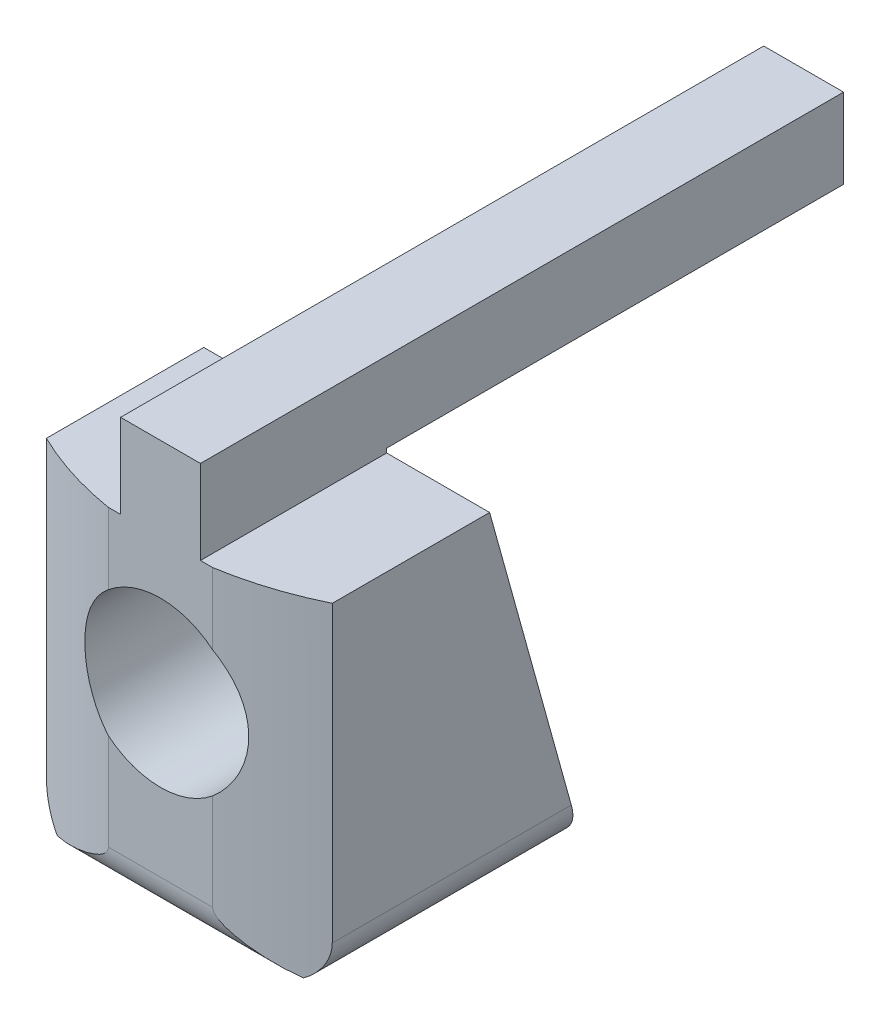
ISO-10303-21;
HEADER;
FILE_DESCRIPTION(('STEP AP214'),'2;1');
FILE_NAME('part.step','',(''),(''),'','','');
FILE_SCHEMA(('AUTOMOTIVE_DESIGN { 1 0 10303 214 1 1 1 1 }'));
ENDSEC;
DATA;
#1=APPLICATION_CONTEXT('core data for automotive mechanical design processes');
#2=APPLICATION_PROTOCOL_DEFINITION('international standard','automotive_design',2000,#1);
#3=PRODUCT_CONTEXT('',#1,'mechanical');
#4=PRODUCT('Part','Part','',(#3));
#5=PRODUCT_RELATED_PRODUCT_CATEGORY('part','',(#4));
#6=PRODUCT_DEFINITION_FORMATION('','',#4);
#7=PRODUCT_DEFINITION_CONTEXT('part definition',#1,'design');
#8=PRODUCT_DEFINITION('design','',#6,#7);
#9=PRODUCT_DEFINITION_SHAPE('','',#8);
#10=(LENGTH_UNIT() NAMED_UNIT(*) SI_UNIT(.MILLI.,.METRE.));
#11=(NAMED_UNIT(*) PLANE_ANGLE_UNIT() SI_UNIT($,.RADIAN.));
#12=(NAMED_UNIT(*) SI_UNIT($,.STERADIAN.) SOLID_ANGLE_UNIT());
#13=UNCERTAINTY_MEASURE_WITH_UNIT(LENGTH_MEASURE(1.E-05),#10,'distance_accuracy_value','');
#14=(GEOMETRIC_REPRESENTATION_CONTEXT(3) GLOBAL_UNCERTAINTY_ASSIGNED_CONTEXT((#13)) GLOBAL_UNIT_ASSIGNED_CONTEXT((#10,
#11,#12)) REPRESENTATION_CONTEXT('',''));
#15=CARTESIAN_POINT('',(0.,0.,0.));
#16=DIRECTION('',(0.,0.,1.));
#17=DIRECTION('',(1.,0.,0.));
#18=AXIS2_PLACEMENT_3D('',#15,#16,#17);
#19=CARTESIAN_POINT('',(0.,18.,0.));
#20=DIRECTION('',(0.,1.,0.));
#21=DIRECTION('',(0.,0.,1.));
#22=AXIS2_PLACEMENT_3D('',#19,#20,#21);
#23=PLANE('',#22);
#24=CARTESIAN_POINT('',(0.,18.,0.));
#25=DIRECTION('',(0.,1.,0.));
#26=DIRECTION('',(0.,0.,1.));
#27=AXIS2_PLACEMENT_3D('',#24,#25,#26);
#28=CIRCLE('',#27,7.75);
#29=CARTESIAN_POINT('',(3.39999999999999,18.,6.96437362581877));
#30=VERTEX_POINT('',#29);
#31=CARTESIAN_POINT('',(1.24096736459909,18.,7.65));
#32=VERTEX_POINT('',#31);
#33=EDGE_CURVE('E548',#30,#32,#28,.F.);
#34=ORIENTED_EDGE('',*,*,#33,.F.);
#35=DIRECTION('',(0.,0.,1.));
#36=VECTOR('',#35,1.);
#37=CARTESIAN_POINT('',(3.39999999999999,18.,7.65));
#38=LINE('',#37,#36);
#39=CARTESIAN_POINT('',(3.39999999999999,18.,3.22055425492012));
#40=VERTEX_POINT('',#39);
#41=EDGE_CURVE('E303',#40,#30,#38,.T.);
#42=ORIENTED_EDGE('',*,*,#41,.F.);
#43=DIRECTION('',(-1.,0.,0.));
#44=VECTOR('',#43,1.);
#45=CARTESIAN_POINT('',(7.6774622910604,18.,3.22055425492012));
#46=LINE('',#45,#44);
#47=CARTESIAN_POINT('',(0.95,18.,3.22055425492012));
#48=VERTEX_POINT('',#47);
#49=EDGE_CURVE('E227',#40,#48,#46,.T.);
#50=ORIENTED_EDGE('',*,*,#49,.T.);
#51=DIRECTION('',(0.,0.,1.));
#52=VECTOR('',#51,1.);
#53=CARTESIAN_POINT('',(0.95,18.,-10.4086228448267));
#54=LINE('',#53,#52);
#55=CARTESIAN_POINT('',(0.95,18.,7.65));
#56=VERTEX_POINT('',#55);
#57=EDGE_CURVE('E203',#48,#56,#54,.T.);
#58=ORIENTED_EDGE('',*,*,#57,.T.);
#59=DIRECTION('',(-1.,0.,0.));
#60=VECTOR('',#59,1.);
#61=CARTESIAN_POINT('',(3.39999999999999,18.,7.65));
#62=LINE('',#61,#60);
#63=EDGE_CURVE('E299',#32,#56,#62,.T.);
#64=ORIENTED_EDGE('',*,*,#63,.F.);
#65=EDGE_LOOP('',(#34,#42,#50,#58,#64));
#66=FACE_BOUND('',#65,.T.);
#67=ADVANCED_FACE('F37',(#66),#23,.T.);
#68=CARTESIAN_POINT('',(0.,18.,0.));
#69=DIRECTION('',(0.,1.,0.));
#70=DIRECTION('',(0.,0.,1.));
#71=AXIS2_PLACEMENT_3D('',#68,#69,#70);
#72=CIRCLE('',#71,7.75);
#73=CARTESIAN_POINT('',(-1.24096736459909,18.,7.65));
#74=VERTEX_POINT('',#73);
#75=CARTESIAN_POINT('',(-3.4,18.,6.96437362581876));
#76=VERTEX_POINT('',#75);
#77=EDGE_CURVE('E365',#74,#76,#72,.F.);
#78=ORIENTED_EDGE('',*,*,#77,.F.);
#79=CARTESIAN_POINT('',(-0.95,18.,7.65));
#80=VERTEX_POINT('',#79);
#81=EDGE_CURVE('E302',#80,#74,#62,.T.);
#82=ORIENTED_EDGE('',*,*,#81,.F.);
#83=DIRECTION('',(0.,0.,1.));
#84=VECTOR('',#83,1.);
#85=CARTESIAN_POINT('',(-0.95,18.,-10.4086228448267));
#86=LINE('',#85,#84);
#87=CARTESIAN_POINT('',(-0.95,18.,3.22055425492012));
#88=VERTEX_POINT('',#87);
#89=EDGE_CURVE('E315',#88,#80,#86,.T.);
#90=ORIENTED_EDGE('',*,*,#89,.F.);
#91=CARTESIAN_POINT('',(-3.4,18.,3.22055425492012));
#92=VERTEX_POINT('',#91);
#93=EDGE_CURVE('E232',#88,#92,#46,.T.);
#94=ORIENTED_EDGE('',*,*,#93,.T.);
#95=DIRECTION('',(0.,0.,-1.));
#96=VECTOR('',#95,1.);
#97=CARTESIAN_POINT('',(-3.4,18.,7.65));
#98=LINE('',#97,#96);
#99=EDGE_CURVE('E298',#76,#92,#98,.T.);
#100=ORIENTED_EDGE('',*,*,#99,.F.);
#101=EDGE_LOOP('',(#78,#82,#90,#94,#100));
#102=FACE_BOUND('',#101,.T.);
#103=ADVANCED_FACE('F409',(#102),#23,.T.);
#104=CARTESIAN_POINT('',(3.4,-4.24305826305338,7.65));
#105=DIRECTION('',(0.,0.,-1.));
#106=DIRECTION('',(-1.,0.,0.));
#107=AXIS2_PLACEMENT_3D('',#104,#105,#106);
#108=PLANE('',#107);
#109=DIRECTION('',(1.,0.,0.));
#110=VECTOR('',#109,1.);
#111=CARTESIAN_POINT('',(3.4,11.,7.65));
#112=LINE('',#111,#110);
#113=CARTESIAN_POINT('',(-1.24096736459909,11.,7.65));
#114=VERTEX_POINT('',#113);
#115=CARTESIAN_POINT('',(1.24096736459909,11.,7.65));
#116=VERTEX_POINT('',#115);
#117=EDGE_CURVE('E210',#114,#116,#112,.T.);
#118=ORIENTED_EDGE('',*,*,#117,.T.);
#119=DIRECTION('',(0.,-1.,0.));
#120=VECTOR('',#119,1.);
#121=CARTESIAN_POINT('',(1.24096736459909,47.980877883616,7.65));
#122=LINE('',#121,#120);
#123=CARTESIAN_POINT('',(1.24096736459909,13.2958391043509,7.65));
#124=VERTEX_POINT('',#123);
#125=EDGE_CURVE('E197',#116,#124,#122,.F.);
#126=ORIENTED_EDGE('',*,*,#125,.T.);
#127=CARTESIAN_POINT('',(0.,14.8,7.65));
#128=DIRECTION('',(0.,0.,1.));
#129=DIRECTION('',(1.,0.,0.));
#130=AXIS2_PLACEMENT_3D('',#127,#128,#129);
#131=CIRCLE('',#130,1.95);
#132=CARTESIAN_POINT('',(-1.24096736459909,13.2958391043509,7.65));
#133=VERTEX_POINT('',#132);
#134=EDGE_CURVE('E208',#133,#124,#131,.T.);
#135=ORIENTED_EDGE('',*,*,#134,.F.);
#136=DIRECTION('',(0.,-1.,0.));
#137=VECTOR('',#136,1.);
#138=CARTESIAN_POINT('',(-1.24096736459909,47.980877883616,7.65));
#139=LINE('',#138,#137);
#140=EDGE_CURVE('E59',#133,#114,#139,.T.);
#141=ORIENTED_EDGE('',*,*,#140,.T.);
#142=EDGE_LOOP('',(#118,#126,#135,#141));
#143=FACE_BOUND('',#142,.T.);
#144=ADVANCED_FACE('F207',(#143),#108,.F.);
#145=CARTESIAN_POINT('',(0.,14.8,-7.65));
#146=DIRECTION('',(0.,0.,1.));
#147=DIRECTION('',(1.,0.,0.));
#148=AXIS2_PLACEMENT_3D('',#145,#146,#147);
#149=CYLINDRICAL_SURFACE('',#148,0.975000000000001);
#150=CARTESIAN_POINT('',(0.,14.8,2.33233255295207));
#151=DIRECTION('',(0.,-0.267457349569895,0.963569699690192));
#152=DIRECTION('',(0.,0.963569699690192,0.267457349569895));
#153=AXIS2_PLACEMENT_3D('',#150,#151,#152);
#154=ELLIPSE('',#153,1.01186245303633,0.975000000000001);
#155=CARTESIAN_POINT('',(0.,15.775,2.60296260277047));
#156=VERTEX_POINT('',#155);
#157=EDGE_CURVE('E230',#156,#156,#154,.F.);
#158=ORIENTED_EDGE('',*,*,#157,.T.);
#159=EDGE_LOOP('',(#158));
#160=FACE_BOUND('',#159,.T.);
#161=CARTESIAN_POINT('',(0.,14.8,4.15));
#162=DIRECTION('',(0.,0.,1.));
#163=DIRECTION('',(1.,0.,0.));
#164=AXIS2_PLACEMENT_3D('',#161,#162,#163);
#165=CIRCLE('',#164,0.975000000000001);
#166=CARTESIAN_POINT('',(0.975000000000001,14.8,4.15));
#167=VERTEX_POINT('',#166);
#168=EDGE_CURVE('E226',#167,#167,#165,.F.);
#169=ORIENTED_EDGE('',*,*,#168,.F.);
#170=EDGE_LOOP('',(#169));
#171=FACE_BOUND('',#170,.T.);
#172=ADVANCED_FACE('F425',(#160,#171),#149,.F.);
#173=CARTESIAN_POINT('',(0.,10.,6.65));
#174=DIRECTION('',(0.,0.,1.));
#175=DIRECTION('',(1.,0.,0.));
#176=AXIS2_PLACEMENT_3D('',#173,#174,#175);
#177=PLANE('',#176);
#178=DIRECTION('',(1.,0.,0.));
#179=VECTOR('',#178,1.);
#180=CARTESIAN_POINT('',(0.,12.5,6.65));
#181=LINE('',#180,#179);
#182=CARTESIAN_POINT('',(-2.4,12.5,6.65));
#183=VERTEX_POINT('',#182);
#184=CARTESIAN_POINT('',(-0.499999999999998,12.5,6.65));
#185=VERTEX_POINT('',#184);
#186=EDGE_CURVE('E282',#183,#185,#181,.T.);
#187=ORIENTED_EDGE('',*,*,#186,.T.);
#188=DIRECTION('',(0.,1.,0.));
#189=VECTOR('',#188,1.);
#190=CARTESIAN_POINT('',(-0.499999999999997,10.,6.65));
#191=LINE('',#190,#189);
#192=CARTESIAN_POINT('',(-0.499999999999997,10.,6.65));
#193=VERTEX_POINT('',#192);
#194=EDGE_CURVE('E295',#193,#185,#191,.T.);
#195=ORIENTED_EDGE('',*,*,#194,.F.);
#196=DIRECTION('',(1.,0.,0.));
#197=VECTOR('',#196,1.);
#198=CARTESIAN_POINT('',(0.,10.,6.65));
#199=LINE('',#198,#197);
#200=CARTESIAN_POINT('',(-2.4,10.,6.65));
#201=VERTEX_POINT('',#200);
#202=EDGE_CURVE('E284',#201,#193,#199,.T.);
#203=ORIENTED_EDGE('',*,*,#202,.F.);
#204=DIRECTION('',(0.,1.,0.));
#205=VECTOR('',#204,1.);
#206=CARTESIAN_POINT('',(-2.4,10.,6.65));
#207=LINE('',#206,#205);
#208=EDGE_CURVE('E287',#201,#183,#207,.T.);
#209=ORIENTED_EDGE('',*,*,#208,.T.);
#210=EDGE_LOOP('',(#187,#195,#203,#209));
#211=FACE_BOUND('',#210,.T.);
#212=ADVANCED_FACE('F421',(#211),#177,.F.);
#213=CARTESIAN_POINT('',(0.,10.,6.65));
#214=DIRECTION('',(0.,0.,1.));
#215=DIRECTION('',(1.,0.,0.));
#216=AXIS2_PLACEMENT_3D('',#213,#214,#215);
#217=PLANE('',#216);
#218=DIRECTION('',(1.,0.,0.));
#219=VECTOR('',#218,1.);
#220=CARTESIAN_POINT('',(0.,12.5,6.65));
#221=LINE('',#220,#219);
#222=CARTESIAN_POINT('',(0.450000000000002,12.5,6.65));
#223=VERTEX_POINT('',#222);
#224=CARTESIAN_POINT('',(2.4,12.5,6.65));
#225=VERTEX_POINT('',#224);
#226=EDGE_CURVE('E259',#223,#225,#221,.T.);
#227=ORIENTED_EDGE('',*,*,#226,.T.);
#228=DIRECTION('',(0.,1.,0.));
#229=VECTOR('',#228,1.);
#230=CARTESIAN_POINT('',(2.4,10.,6.65));
#231=LINE('',#230,#229);
#232=CARTESIAN_POINT('',(2.4,10.,6.65));
#233=VERTEX_POINT('',#232);
#234=EDGE_CURVE('E275',#233,#225,#231,.T.);
#235=ORIENTED_EDGE('',*,*,#234,.F.);
#236=DIRECTION('',(1.,0.,0.));
#237=VECTOR('',#236,1.);
#238=CARTESIAN_POINT('',(0.,10.,6.65));
#239=LINE('',#238,#237);
#240=CARTESIAN_POINT('',(0.450000000000003,10.,6.65));
#241=VERTEX_POINT('',#240);
#242=EDGE_CURVE('E262',#241,#233,#239,.T.);
#243=ORIENTED_EDGE('',*,*,#242,.F.);
#244=DIRECTION('',(0.,1.,0.));
#245=VECTOR('',#244,1.);
#246=CARTESIAN_POINT('',(0.450000000000003,10.,6.65));
#247=LINE('',#246,#245);
#248=EDGE_CURVE('E265',#241,#223,#247,.T.);
#249=ORIENTED_EDGE('',*,*,#248,.T.);
#250=EDGE_LOOP('',(#227,#235,#243,#249));
#251=FACE_BOUND('',#250,.T.);
#252=ADVANCED_FACE('F424',(#251),#217,.F.);
#253=CARTESIAN_POINT('',(3.4,11.,6.65));
#254=DIRECTION('',(-1.,0.,0.));
#255=DIRECTION('',(0.,0.,1.));
#256=AXIS2_PLACEMENT_3D('',#253,#254,#255);
#257=CYLINDRICAL_SURFACE('',#256,1.);
#258=CARTESIAN_POINT('',(1.24096736459909,11.,7.65));
#259=CARTESIAN_POINT('',(1.24093163818135,10.9896346048764,7.65000521503751));
#260=CARTESIAN_POINT('',(1.24195937838972,10.979322897208,7.64983911613211));
#261=CARTESIAN_POINT('',(1.2457927821418,10.9592072529436,7.64921605494315));
#262=CARTESIAN_POINT('',(1.248569793838,10.9493978375158,7.64876377950391));
#263=CARTESIAN_POINT('',(1.25678379767317,10.927043663576,7.64741888123309));
#264=CARTESIAN_POINT('',(1.26280874583263,10.9147271252458,7.64642803323159));
#265=CARTESIAN_POINT('',(1.2766708702492,10.8911220153178,7.64412602219138));
#266=CARTESIAN_POINT('',(1.28452096644589,10.8798416124525,7.64281257157205));
#267=CARTESIAN_POINT('',(1.31381448578811,10.8422596239088,7.63785485724309));
#268=CARTESIAN_POINT('',(1.3382028979111,10.8183938971112,7.63363446628692));
#269=CARTESIAN_POINT('',(1.38978337310943,10.7741261443382,7.6244155791193));
#270=CARTESIAN_POINT('',(1.41699244175099,10.7537473561336,7.61941225812819));
#271=CARTESIAN_POINT('',(1.4719769665497,10.7158629766878,7.60897756857772));
#272=CARTESIAN_POINT('',(1.49970714753179,10.6982867983344,7.60356478994333));
#273=CARTESIAN_POINT('',(1.55596919923123,10.6646265312,7.59225180772251));
#274=CARTESIAN_POINT('',(1.58450166237991,10.6485435848878,7.5863512373469));
#275=CARTESIAN_POINT('',(1.67096014094203,10.6018853854711,7.56794953020375));
#276=CARTESIAN_POINT('',(1.72963643768736,10.5729715102898,7.5547692312593));
#277=CARTESIAN_POINT('',(1.84803623214141,10.5179513844354,7.52668488803285));
#278=CARTESIAN_POINT('',(1.9077619799339,10.4918523288687,7.51177661938508));
#279=CARTESIAN_POINT('',(2.02763283964394,10.4419196691105,7.48031021394329));
#280=CARTESIAN_POINT('',(2.08777738225741,10.4180834623394,7.46375401852516));
#281=CARTESIAN_POINT('',(2.2570081108852,10.3537937944106,7.41493547785777));
#282=CARTESIAN_POINT('',(2.36637133196365,10.3154761220434,7.38079187528405));
#283=CARTESIAN_POINT('',(2.58514107603378,10.2444157694378,7.30704407484249));
#284=CARTESIAN_POINT('',(2.6945475793908,10.2116768172163,7.26743625721443));
#285=CARTESIAN_POINT('',(2.91069515988035,10.1527158556351,7.18355884718812));
#286=CARTESIAN_POINT('',(3.01744594207056,10.1263770905706,7.13939774927689));
#287=CARTESIAN_POINT('',(3.17683542303649,10.0917321287108,7.06919991869532));
#288=CARTESIAN_POINT('',(3.22983111121372,10.080996131544,7.04514689488522));
#289=CARTESIAN_POINT('',(3.33554132048661,10.0612850194669,6.99571792297116));
#290=CARTESIAN_POINT('',(3.38825579829244,10.0523101684694,6.97034177731359));
#291=CARTESIAN_POINT('',(3.44079999999999,10.0442889693432,6.94430668677587));
#292=B_SPLINE_CURVE_WITH_KNOTS('',3,(#258,#259,#260,#261,#262,#263,#264,#265,#266,#267,#268,
#269,#270,#271,#272,#273,#274,#275,#276,#277,#278,#279,#280,#281,#282,#283,#284,#285,#286,#287,
#288,#289,#290,#291),.UNSPECIFIED.,.F.,.F.,(4,2,2,2,2,2,2,2,2,2,2,2,2,2,2,2,4),(0.,
0.0309579418175619,0.0614215486300017,0.102427854921658,0.143733786549859,0.246079305462019,
0.349082348210807,0.448821157923139,0.548635659367184,0.748662724491045,0.949189541080553,
1.14948285753454,1.51161984045719,1.87399788278123,2.22916227405236,2.40666787674531,
2.58420005888926),.UNSPECIFIED.);
#293=CARTESIAN_POINT('',(2.92629933779418,10.1497006368123,7.17629933779419));
#294=VERTEX_POINT('',#293);
#295=EDGE_CURVE('E211',#116,#294,#292,.T.);
#296=ORIENTED_EDGE('',*,*,#295,.F.);
#297=ORIENTED_EDGE('',*,*,#117,.F.);
#298=CARTESIAN_POINT('',(-3.4408,10.0442889693432,6.94430668677587));
#299=CARTESIAN_POINT('',(-3.37751032060506,10.0539556989694,6.97566684510306));
#300=CARTESIAN_POINT('',(-3.31396960226758,10.0649989010673,7.00607160247574));
#301=CARTESIAN_POINT('',(-3.18649999414957,10.0895981062814,7.06495874460419));
#302=CARTESIAN_POINT('',(-3.12257118807371,10.1031535849462,7.09344152889276));
#303=CARTESIAN_POINT('',(-2.99432137873097,10.1325624002093,7.14852551699959));
#304=CARTESIAN_POINT('',(-2.92999994593676,10.1484189887002,7.17512397740891));
#305=CARTESIAN_POINT('',(-2.80115431782198,10.1822558135498,7.22639923388908));
#306=CARTESIAN_POINT('',(-2.73663011293109,10.2002361516548,7.25107593779676));
#307=CARTESIAN_POINT('',(-2.54180678531707,10.2574804737465,7.32263223522308));
#308=CARTESIAN_POINT('',(-2.4112983063354,10.2998054207102,7.36659195971751));
#309=CARTESIAN_POINT('',(-2.21605613654953,10.369419856692,7.42672462778011));
#310=CARTESIAN_POINT('',(-2.15108348808152,10.3936368529404,7.44579570373915));
#311=CARTESIAN_POINT('',(-2.02150191230989,10.4443681145529,7.48201495555448));
#312=CARTESIAN_POINT('',(-1.95689290893845,10.4708818788944,7.4991635489225));
#313=CARTESIAN_POINT('',(-1.84944275076634,10.5176090621847,7.5262241683845));
#314=CARTESIAN_POINT('',(-1.80639644262566,10.5370452562493,7.53666802366439));
#315=CARTESIAN_POINT('',(-1.720913883905,10.5774998820069,7.55664446484432));
#316=CARTESIAN_POINT('',(-1.67847678163685,10.5985157816695,7.56617845569912));
#317=CARTESIAN_POINT('',(-1.60785892655203,10.6357268712269,7.58143460696733));
#318=CARTESIAN_POINT('',(-1.57942471687937,10.6513374559664,7.58740681917093));
#319=CARTESIAN_POINT('',(-1.52317296819237,10.6839445819497,7.5988991042179));
#320=CARTESIAN_POINT('',(-1.49535680350496,10.7009438819464,7.60441823115231));
#321=CARTESIAN_POINT('',(-1.44052884153306,10.7370522781917,7.61499620009963));
#322=CARTESIAN_POINT('',(-1.41353120961608,10.7561848249994,7.62004852026768));
#323=CARTESIAN_POINT('',(-1.36169157726714,10.7973444206952,7.6294806065953));
#324=CARTESIAN_POINT('',(-1.3368419647691,10.8193604889549,7.63386279393087));
#325=CARTESIAN_POINT('',(-1.30540598892451,10.8535961495957,7.63927371660451));
#326=CARTESIAN_POINT('',(-1.29676546635906,10.8638285424794,7.64074386756699));
#327=CARTESIAN_POINT('',(-1.28069431590897,10.8852546147083,7.6434538893739));
#328=CARTESIAN_POINT('',(-1.27326332535057,10.8964480043587,7.64469382926204));
#329=CARTESIAN_POINT('',(-1.26145464735814,10.9176661866604,7.64665032977123));
#330=CARTESIAN_POINT('',(-1.25676511390274,10.9275092368982,7.64742156543902));
#331=CARTESIAN_POINT('',(-1.24902705055914,10.9478244944858,7.64868923562852));
#332=CARTESIAN_POINT('',(-1.24597230547519,10.9582941482413,7.64918671114826));
#333=CARTESIAN_POINT('',(-1.24295938197463,10.9740610729958,7.64967665456325));
#334=CARTESIAN_POINT('',(-1.2422170914341,10.9792102039289,7.64979719369761));
#335=CARTESIAN_POINT('',(-1.24121922552058,10.9895715064014,7.64995914630468));
#336=CARTESIAN_POINT('',(-1.24096507411673,10.9947838178759,7.65000032828276));
#337=CARTESIAN_POINT('',(-1.24096736460068,11.0000000000003,7.6500000000001));
#338=B_SPLINE_CURVE_WITH_KNOTS('',3,(#298,#299,#300,#301,#302,#303,#304,#305,#306,#307,#308,
#309,#310,#311,#312,#313,#314,#315,#316,#317,#318,#319,#320,#321,#322,#323,#324,#325,#326,#327,
#328,#329,#330,#331,#332,#333,#334,#335,#336,#337),.UNSPECIFIED.,.F.,.F.,(4,2,2,2,2,2,2,2,2,2,2,
2,2,2,2,2,2,2,2,4),(0.,0.21383846987235,0.427632349960435,0.64173135675266,0.855840624942972,
1.28752574110782,1.50322624036344,1.71887980412797,1.8639688184303,2.00883004217045,
2.1077548717552,2.20688123616966,2.30723106928113,2.40720930902037,2.44756746664715,
2.48791350064536,2.52059778543167,2.55315691094331,2.56874672850816,2.58438195505587),.UNSPECIFIED.);
#339=CARTESIAN_POINT('',(-2.92629933779418,10.1497006368123,7.17629933779419));
#340=VERTEX_POINT('',#339);
#341=EDGE_CURVE('E357',#340,#114,#338,.T.);
#342=ORIENTED_EDGE('',*,*,#341,.F.);
#343=CARTESIAN_POINT('',(-2.4,11.,6.65));
#344=DIRECTION('',(-0.707106781186547,0.,-0.707106781186547));
#345=DIRECTION('',(0.707106781186547,0.,-0.707106781186547));
#346=AXIS2_PLACEMENT_3D('',#343,#344,#345);
#347=ELLIPSE('',#346,1.41421356237309,1.);
#348=EDGE_CURVE('E269',#201,#340,#347,.T.);
#349=ORIENTED_EDGE('',*,*,#348,.F.);
#350=ORIENTED_EDGE('',*,*,#202,.T.);
#351=DIRECTION('',(1.,0.,0.));
#352=VECTOR('',#351,1.);
#353=CARTESIAN_POINT('',(-3.4,10.,6.65));
#354=LINE('',#353,#352);
#355=EDGE_CURVE('E301',#241,#193,#354,.F.);
#356=ORIENTED_EDGE('',*,*,#355,.F.);
#357=ORIENTED_EDGE('',*,*,#242,.T.);
#358=CARTESIAN_POINT('',(2.39999999999999,11.,6.65));
#359=DIRECTION('',(-0.707106781186547,0.,0.707106781186547));
#360=DIRECTION('',(-0.707106781186547,0.,-0.707106781186547));
#361=AXIS2_PLACEMENT_3D('',#358,#359,#360);
#362=ELLIPSE('',#361,1.41421356237309,1.);
#363=EDGE_CURVE('E255',#294,#233,#362,.F.);
#364=ORIENTED_EDGE('',*,*,#363,.F.);
#365=EDGE_LOOP('',(#296,#297,#342,#349,#350,#356,#357,#364));
#366=FACE_BOUND('',#365,.T.);
#367=ADVANCED_FACE('F39',(#366),#257,.T.);
#368=CARTESIAN_POINT('',(0.,12.5,0.));
#369=DIRECTION('',(0.,-1.,0.));
#370=DIRECTION('',(0.,0.,-1.));
#371=AXIS2_PLACEMENT_3D('',#368,#369,#370);
#372=PLANE('',#371);
#373=DIRECTION('',(-1.,0.,0.));
#374=VECTOR('',#373,1.);
#375=CARTESIAN_POINT('',(0.,12.5,1.69392320466254));
#376=LINE('',#375,#374);
#377=CARTESIAN_POINT('',(-0.499999999999997,12.5,1.69392320466254));
#378=VERTEX_POINT('',#377);
#379=CARTESIAN_POINT('',(-2.4,12.5,1.69392320466254));
#380=VERTEX_POINT('',#379);
#381=EDGE_CURVE('E251',#378,#380,#376,.T.);
#382=ORIENTED_EDGE('',*,*,#381,.F.);
#383=DIRECTION('',(0.,0.,1.));
#384=VECTOR('',#383,1.);
#385=CARTESIAN_POINT('',(-0.499999999999998,12.5,0.));
#386=LINE('',#385,#384);
#387=EDGE_CURVE('E289',#378,#185,#386,.T.);
#388=ORIENTED_EDGE('',*,*,#387,.T.);
#389=ORIENTED_EDGE('',*,*,#186,.F.);
#390=DIRECTION('',(0.,0.,1.));
#391=VECTOR('',#390,1.);
#392=CARTESIAN_POINT('',(-2.4,12.5,0.));
#393=LINE('',#392,#391);
#394=EDGE_CURVE('E278',#380,#183,#393,.T.);
#395=ORIENTED_EDGE('',*,*,#394,.F.);
#396=EDGE_LOOP('',(#382,#388,#389,#395));
#397=FACE_BOUND('',#396,.T.);
#398=ADVANCED_FACE('F389',(#397),#372,.T.);
#399=CARTESIAN_POINT('',(-0.499999999999997,10.,0.));
#400=DIRECTION('',(-1.,0.,0.));
#401=DIRECTION('',(0.,-1.,0.));
#402=AXIS2_PLACEMENT_3D('',#399,#400,#401);
#403=PLANE('',#402);
#404=DIRECTION('',(0.,0.963569699690192,0.267457349569895));
#405=VECTOR('',#404,1.);
#406=CARTESIAN_POINT('',(-0.499999999999997,9.742286201995,0.928466566161048));
#407=LINE('',#406,#405);
#408=CARTESIAN_POINT('',(-0.499999999999997,10.,1.));
#409=VERTEX_POINT('',#408);
#410=EDGE_CURVE('E253',#409,#378,#407,.T.);
#411=ORIENTED_EDGE('',*,*,#410,.F.);
#412=DIRECTION('',(0.,0.,1.));
#413=VECTOR('',#412,1.);
#414=CARTESIAN_POINT('',(-0.499999999999997,10.,0.));
#415=LINE('',#414,#413);
#416=EDGE_CURVE('E281',#409,#193,#415,.T.);
#417=ORIENTED_EDGE('',*,*,#416,.T.);
#418=ORIENTED_EDGE('',*,*,#194,.T.);
#419=ORIENTED_EDGE('',*,*,#387,.F.);
#420=EDGE_LOOP('',(#411,#417,#418,#419));
#421=FACE_BOUND('',#420,.T.);
#422=ADVANCED_FACE('F380',(#421),#403,.T.);
#423=CARTESIAN_POINT('',(-2.4,11.,7.65));
#424=DIRECTION('',(0.,0.,-1.));
#425=DIRECTION('',(-1.,0.,0.));
#426=AXIS2_PLACEMENT_3D('',#423,#424,#425);
#427=CYLINDRICAL_SURFACE('',#426,1.);
#428=CARTESIAN_POINT('',(-3.4,11.,6.96437362581876));
#429=CARTESIAN_POINT('',(-3.40000124837869,10.9737319356733,6.964372077772));
#430=CARTESIAN_POINT('',(-3.3989642504303,10.9474775115454,6.96487937026964));
#431=CARTESIAN_POINT('',(-3.39483676988903,10.8951773538941,6.96689250911004));
#432=CARTESIAN_POINT('',(-3.39174694060837,10.8691315566435,6.9683980377645));
#433=CARTESIAN_POINT('',(-3.37947058035228,10.7917988630942,6.97436489867533));
#434=CARTESIAN_POINT('',(-3.36727666840523,10.7410646676367,6.98027689417444));
#435=CARTESIAN_POINT('',(-3.33540425733508,10.6426518849986,6.99556184330124));
#436=CARTESIAN_POINT('',(-3.31573168797467,10.5949709118516,7.00493205476815));
#437=CARTESIAN_POINT('',(-3.26964072741116,10.5036715898417,7.02656359422629));
#438=CARTESIAN_POINT('',(-3.24321713732639,10.460056407486,7.03882714978799));
#439=CARTESIAN_POINT('',(-3.18304840546338,10.3757844633049,7.06624687758673));
#440=CARTESIAN_POINT('',(-3.14901019503691,10.3353739725557,7.08151454069358));
#441=CARTESIAN_POINT('',(-3.07543583637182,10.2607195115873,7.11377593207968));
#442=CARTESIAN_POINT('',(-3.03589758625858,10.2264779103842,7.13077031956493));
#443=CARTESIAN_POINT('',(-2.94844595090823,10.1618915607481,7.16739910219347));
#444=CARTESIAN_POINT('',(-2.90009704741245,10.1321920075799,7.18713268585055));
#445=CARTESIAN_POINT('',(-2.79923090892749,10.0814123958111,7.22701525458663));
#446=CARTESIAN_POINT('',(-2.74671382180635,10.0603320316041,7.24716422491085));
#447=CARTESIAN_POINT('',(-2.6455563061863,10.0293626110268,7.28464497297555));
#448=CARTESIAN_POINT('',(-2.59725487093376,10.0184021102321,7.30201335246494));
#449=CARTESIAN_POINT('',(-2.49936890369453,10.0037166155534,7.33610217010936));
#450=CARTESIAN_POINT('',(-2.44978495208166,9.99998840496071,7.35282289307827));
#451=CARTESIAN_POINT('',(-2.4,10.,7.36902300172825));
#452=B_SPLINE_CURVE_WITH_KNOTS('',3,(#428,#429,#430,#431,#432,#433,#434,#435,#436,#437,#438,
#439,#440,#441,#442,#443,#444,#445,#446,#447,#448,#449,#450,#451),.UNSPECIFIED.,.F.,.F.,(4,2,2,
2,2,2,2,2,2,2,2,4),(0.,0.0787522941434078,0.157479537418689,0.31418830080672,0.470773069455408,
0.627478787573334,0.791788958198133,0.956162094374572,1.13560695508707,1.31504545276222,
1.47199614066303,1.62887700552307),.UNSPECIFIED.);
#453=CARTESIAN_POINT('',(-3.4,11.,6.96437362581876));
#454=VERTEX_POINT('',#453);
#455=EDGE_CURVE('E367',#454,#340,#452,.T.);
#456=ORIENTED_EDGE('',*,*,#455,.F.);
#457=DIRECTION('',(0.,0.,1.));
#458=VECTOR('',#457,1.);
#459=CARTESIAN_POINT('',(-3.4,11.,7.65));
#460=LINE('',#459,#458);
#461=CARTESIAN_POINT('',(-3.4,11.,1.27756928186502));
#462=VERTEX_POINT('',#461);
#463=EDGE_CURVE('E312',#462,#454,#460,.T.);
#464=ORIENTED_EDGE('',*,*,#463,.F.);
#465=CARTESIAN_POINT('',(-2.4,11.,1.27756928186502));
#466=DIRECTION('',(0.,-0.267457349569895,0.963569699690192));
#467=DIRECTION('',(0.,-0.963569699690192,-0.267457349569895));
#468=AXIS2_PLACEMENT_3D('',#465,#466,#467);
#469=ELLIPSE('',#468,1.03780764413983,1.);
#470=CARTESIAN_POINT('',(-2.4,10.,1.));
#471=VERTEX_POINT('',#470);
#472=EDGE_CURVE('E246',#471,#462,#469,.F.);
#473=ORIENTED_EDGE('',*,*,#472,.F.);
#474=DIRECTION('',(0.,0.,1.));
#475=VECTOR('',#474,1.);
#476=CARTESIAN_POINT('',(-2.4,10.,0.));
#477=LINE('',#476,#475);
#478=EDGE_CURVE('E279',#471,#201,#477,.T.);
#479=ORIENTED_EDGE('',*,*,#478,.T.);
#480=ORIENTED_EDGE('',*,*,#348,.T.);
#481=EDGE_LOOP('',(#456,#464,#473,#479,#480));
#482=FACE_BOUND('',#481,.T.);
#483=ADVANCED_FACE('F376',(#482),#427,.T.);
#484=CARTESIAN_POINT('',(-2.4,10.,0.));
#485=DIRECTION('',(-1.,0.,0.));
#486=DIRECTION('',(0.,-1.,0.));
#487=AXIS2_PLACEMENT_3D('',#484,#485,#486);
#488=PLANE('',#487);
#489=ORIENTED_EDGE('',*,*,#478,.F.);
#490=DIRECTION('',(0.,0.963569699690192,0.267457349569895));
#491=VECTOR('',#490,1.);
#492=CARTESIAN_POINT('',(-2.4,9.742286201995,0.928466566161048));
#493=LINE('',#492,#491);
#494=EDGE_CURVE('E248',#471,#380,#493,.T.);
#495=ORIENTED_EDGE('',*,*,#494,.T.);
#496=ORIENTED_EDGE('',*,*,#394,.T.);
#497=ORIENTED_EDGE('',*,*,#208,.F.);
#498=EDGE_LOOP('',(#489,#495,#496,#497));
#499=FACE_BOUND('',#498,.T.);
#500=ADVANCED_FACE('F379',(#499),#488,.F.);
#501=DIRECTION('',(-1.,0.,0.));
#502=VECTOR('',#501,1.);
#503=CARTESIAN_POINT('',(0.,12.5,1.69392320466254));
#504=LINE('',#503,#502);
#505=CARTESIAN_POINT('',(2.4,12.5,1.69392320466254));
#506=VERTEX_POINT('',#505);
#507=CARTESIAN_POINT('',(0.450000000000002,12.5,1.69392320466254));
#508=VERTEX_POINT('',#507);
#509=EDGE_CURVE('E241',#506,#508,#504,.T.);
#510=ORIENTED_EDGE('',*,*,#509,.F.);
#511=DIRECTION('',(0.,0.,1.));
#512=VECTOR('',#511,1.);
#513=CARTESIAN_POINT('',(2.4,12.5,0.));
#514=LINE('',#513,#512);
#515=EDGE_CURVE('E268',#506,#225,#514,.T.);
#516=ORIENTED_EDGE('',*,*,#515,.T.);
#517=ORIENTED_EDGE('',*,*,#226,.F.);
#518=DIRECTION('',(0.,0.,1.));
#519=VECTOR('',#518,1.);
#520=CARTESIAN_POINT('',(0.450000000000002,12.5,0.));
#521=LINE('',#520,#519);
#522=EDGE_CURVE('E266',#508,#223,#521,.T.);
#523=ORIENTED_EDGE('',*,*,#522,.F.);
#524=EDGE_LOOP('',(#510,#516,#517,#523));
#525=FACE_BOUND('',#524,.T.);
#526=ADVANCED_FACE('F387',(#525),#372,.T.);
#527=CARTESIAN_POINT('',(2.39999999999999,11.,0.));
#528=DIRECTION('',(0.,0.,-1.));
#529=DIRECTION('',(-1.,0.,0.));
#530=AXIS2_PLACEMENT_3D('',#527,#528,#529);
#531=CYLINDRICAL_SURFACE('',#530,1.);
#532=CARTESIAN_POINT('',(2.39999999999999,10.,7.36902300172825));
#533=CARTESIAN_POINT('',(2.45979328771515,9.99997342052511,7.34957901468649));
#534=CARTESIAN_POINT('',(2.51929209307417,10.0053594415997,7.3293671905039));
#535=CARTESIAN_POINT('',(2.63611472503564,10.0264723722292,7.28814903667926));
#536=CARTESIAN_POINT('',(2.69343956742764,10.0421943876972,7.26714308748939));
#537=CARTESIAN_POINT('',(2.80438150853866,10.0834935399025,7.22506045126973));
#538=CARTESIAN_POINT('',(2.85799902640803,10.1090695603896,7.20398377252007));
#539=CARTESIAN_POINT('',(2.96011175058862,10.1694629125895,7.16262985031808));
#540=CARTESIAN_POINT('',(3.00860654899743,10.2042809794365,7.14235267060721));
#541=CARTESIAN_POINT('',(3.09903422653463,10.2824194460832,7.1035844398793));
#542=CARTESIAN_POINT('',(3.14096782242996,10.3257389159951,7.08509319384566));
#543=CARTESIAN_POINT('',(3.21680393447509,10.4199297261164,7.05098611728029));
#544=CARTESIAN_POINT('',(3.25070791892279,10.4707996828691,7.03536976116154));
#545=CARTESIAN_POINT('',(3.30711648078444,10.5752251638976,7.00902210168638));
#546=CARTESIAN_POINT('',(3.33021491314261,10.6283963079869,6.99804082654692));
#547=CARTESIAN_POINT('',(3.3669500663966,10.7385435805203,6.98044196667862));
#548=CARTESIAN_POINT('',(3.38060698386422,10.7955112994101,6.97381506891168));
#549=CARTESIAN_POINT('',(3.39278324180025,10.8775787731601,6.96789308343095));
#550=CARTESIAN_POINT('',(3.39548780153329,10.9019793246101,6.96657503014263));
#551=CARTESIAN_POINT('',(3.39909485034188,10.9509151044635,6.96481566265903));
#552=CARTESIAN_POINT('',(3.3999994991895,10.9754501359905,6.96437329769985));
#553=CARTESIAN_POINT('',(3.39999999999999,11.,6.96437362581877));
#554=B_SPLINE_CURVE_WITH_KNOTS('',3,(#532,#533,#534,#535,#536,#537,#538,#539,#540,#541,#542,
#543,#544,#545,#546,#547,#548,#549,#550,#551,#552,#553),.UNSPECIFIED.,.F.,.F.,(4,2,2,2,2,2,2,2,
2,2,4),(0.,0.188332828959852,0.376576546604908,0.564798946484291,0.753036322508162,
0.941253120494361,1.1294354744632,1.30548964662111,1.48116604197928,1.55485429193219,
1.62845406748429),.UNSPECIFIED.);
#555=CARTESIAN_POINT('',(3.39999999999999,11.,6.96437362581877));
#556=VERTEX_POINT('',#555);
#557=EDGE_CURVE('E348',#294,#556,#554,.T.);
#558=ORIENTED_EDGE('',*,*,#557,.F.);
#559=ORIENTED_EDGE('',*,*,#363,.T.);
#560=DIRECTION('',(0.,0.,1.));
#561=VECTOR('',#560,1.);
#562=CARTESIAN_POINT('',(2.4,10.,0.));
#563=LINE('',#562,#561);
#564=CARTESIAN_POINT('',(2.39999999999999,10.,1.));
#565=VERTEX_POINT('',#564);
#566=EDGE_CURVE('E258',#565,#233,#563,.T.);
#567=ORIENTED_EDGE('',*,*,#566,.F.);
#568=CARTESIAN_POINT('',(2.39999999999999,11.,1.27756928186502));
#569=DIRECTION('',(0.,-0.267457349569895,0.963569699690192));
#570=DIRECTION('',(0.,-0.963569699690192,-0.267457349569895));
#571=AXIS2_PLACEMENT_3D('',#568,#569,#570);
#572=ELLIPSE('',#571,1.03780764413983,1.);
#573=CARTESIAN_POINT('',(3.39999999999999,11.,1.27756928186502));
#574=VERTEX_POINT('',#573);
#575=EDGE_CURVE('E234',#574,#565,#572,.F.);
#576=ORIENTED_EDGE('',*,*,#575,.F.);
#577=DIRECTION('',(0.,0.,1.));
#578=VECTOR('',#577,1.);
#579=CARTESIAN_POINT('',(3.39999999999999,11.,-7.65));
#580=LINE('',#579,#578);
#581=EDGE_CURVE('E309',#556,#574,#580,.F.);
#582=ORIENTED_EDGE('',*,*,#581,.F.);
#583=EDGE_LOOP('',(#558,#559,#567,#576,#582));
#584=FACE_BOUND('',#583,.T.);
#585=ADVANCED_FACE('F382',(#584),#531,.T.);
#586=CARTESIAN_POINT('',(2.4,10.,0.));
#587=DIRECTION('',(-1.,0.,0.));
#588=DIRECTION('',(0.,-1.,0.));
#589=AXIS2_PLACEMENT_3D('',#586,#587,#588);
#590=PLANE('',#589);
#591=DIRECTION('',(0.,0.963569699690192,0.267457349569895));
#592=VECTOR('',#591,1.);
#593=CARTESIAN_POINT('',(2.4,9.742286201995,0.928466566161048));
#594=LINE('',#593,#592);
#595=EDGE_CURVE('E236',#565,#506,#594,.T.);
#596=ORIENTED_EDGE('',*,*,#595,.F.);
#597=ORIENTED_EDGE('',*,*,#566,.T.);
#598=ORIENTED_EDGE('',*,*,#234,.T.);
#599=ORIENTED_EDGE('',*,*,#515,.F.);
#600=EDGE_LOOP('',(#596,#597,#598,#599));
#601=FACE_BOUND('',#600,.T.);
#602=ADVANCED_FACE('F386',(#601),#590,.T.);
#603=CARTESIAN_POINT('',(0.450000000000003,10.,0.));
#604=DIRECTION('',(-1.,0.,0.));
#605=DIRECTION('',(0.,-1.,0.));
#606=AXIS2_PLACEMENT_3D('',#603,#604,#605);
#607=PLANE('',#606);
#608=DIRECTION('',(0.,0.,1.));
#609=VECTOR('',#608,1.);
#610=CARTESIAN_POINT('',(0.450000000000003,10.,0.));
#611=LINE('',#610,#609);
#612=CARTESIAN_POINT('',(0.450000000000003,10.,1.));
#613=VERTEX_POINT('',#612);
#614=EDGE_CURVE('E256',#613,#241,#611,.T.);
#615=ORIENTED_EDGE('',*,*,#614,.F.);
#616=DIRECTION('',(0.,0.963569699690192,0.267457349569895));
#617=VECTOR('',#616,1.);
#618=CARTESIAN_POINT('',(0.450000000000003,9.742286201995,0.928466566161048));
#619=LINE('',#618,#617);
#620=EDGE_CURVE('E243',#613,#508,#619,.T.);
#621=ORIENTED_EDGE('',*,*,#620,.T.);
#622=ORIENTED_EDGE('',*,*,#522,.T.);
#623=ORIENTED_EDGE('',*,*,#248,.F.);
#624=EDGE_LOOP('',(#615,#621,#622,#623));
#625=FACE_BOUND('',#624,.T.);
#626=ADVANCED_FACE('F413',(#625),#607,.F.);
#627=CARTESIAN_POINT('',(0.,10.,0.));
#628=DIRECTION('',(0.,-1.,0.));
#629=DIRECTION('',(0.,0.,-1.));
#630=AXIS2_PLACEMENT_3D('',#627,#628,#629);
#631=PLANE('',#630);
#632=DIRECTION('',(-1.,0.,0.));
#633=VECTOR('',#632,1.);
#634=CARTESIAN_POINT('',(7.6774622910604,10.,1.));
#635=LINE('',#634,#633);
#636=EDGE_CURVE('E225',#613,#409,#635,.T.);
#637=ORIENTED_EDGE('',*,*,#636,.F.);
#638=ORIENTED_EDGE('',*,*,#614,.T.);
#639=ORIENTED_EDGE('',*,*,#355,.T.);
#640=ORIENTED_EDGE('',*,*,#416,.F.);
#641=EDGE_LOOP('',(#637,#638,#639,#640));
#642=FACE_BOUND('',#641,.T.);
#643=ADVANCED_FACE('F401',(#642),#631,.T.);
#644=CARTESIAN_POINT('',(3.4,-4.24305826305338,7.65));
#645=DIRECTION('',(-1.,0.,0.));
#646=DIRECTION('',(0.,-1.,0.));
#647=AXIS2_PLACEMENT_3D('',#644,#645,#646);
#648=PLANE('',#647);
#649=ORIENTED_EDGE('',*,*,#41,.T.);
#650=DIRECTION('',(0.,-1.,0.));
#651=VECTOR('',#650,1.);
#652=CARTESIAN_POINT('',(3.39999999999999,47.980877883616,6.96437362581877));
#653=LINE('',#652,#651);
#654=EDGE_CURVE('E529',#30,#556,#653,.T.);
#655=ORIENTED_EDGE('',*,*,#654,.T.);
#656=ORIENTED_EDGE('',*,*,#581,.T.);
#657=DIRECTION('',(0.,0.963569699690192,0.267457349569895));
#658=VECTOR('',#657,1.);
#659=CARTESIAN_POINT('',(3.4,-1.51040664039565,-2.19493530514892));
#660=LINE('',#659,#658);
#661=EDGE_CURVE('E238',#574,#40,#660,.T.);
#662=ORIENTED_EDGE('',*,*,#661,.T.);
#663=EDGE_LOOP('',(#649,#655,#656,#662));
#664=FACE_BOUND('',#663,.T.);
#665=ADVANCED_FACE('F397',(#664),#648,.F.);
#666=CARTESIAN_POINT('',(-3.39999999999999,-4.24305826305338,7.65));
#667=DIRECTION('',(1.,0.,0.));
#668=DIRECTION('',(0.,1.,0.));
#669=AXIS2_PLACEMENT_3D('',#666,#667,#668);
#670=PLANE('',#669);
#671=ORIENTED_EDGE('',*,*,#463,.T.);
#672=DIRECTION('',(0.,-1.,0.));
#673=VECTOR('',#672,1.);
#674=CARTESIAN_POINT('',(-3.4,47.980877883616,6.96437362581876));
#675=LINE('',#674,#673);
#676=EDGE_CURVE('E364',#454,#76,#675,.F.);
#677=ORIENTED_EDGE('',*,*,#676,.T.);
#678=ORIENTED_EDGE('',*,*,#99,.T.);
#679=DIRECTION('',(0.,0.963569699690192,0.267457349569895));
#680=VECTOR('',#679,1.);
#681=CARTESIAN_POINT('',(-3.4,18.,3.22055425492012));
#682=LINE('',#681,#680);
#683=EDGE_CURVE('E222',#462,#92,#682,.T.);
#684=ORIENTED_EDGE('',*,*,#683,.F.);
#685=EDGE_LOOP('',(#671,#677,#678,#684));
#686=FACE_BOUND('',#685,.T.);
#687=ADVANCED_FACE('F393',(#686),#670,.F.);
#688=CARTESIAN_POINT('',(1.24096736459909,16.3041608956491,7.65));
#689=VERTEX_POINT('',#688);
#690=CARTESIAN_POINT('',(-1.24096736459909,16.3041608956491,7.65));
#691=VERTEX_POINT('',#690);
#692=EDGE_CURVE('E214',#689,#691,#131,.T.);
#693=ORIENTED_EDGE('',*,*,#692,.F.);
#694=EDGE_CURVE('E66',#689,#32,#122,.F.);
#695=ORIENTED_EDGE('',*,*,#694,.T.);
#696=ORIENTED_EDGE('',*,*,#63,.T.);
#697=DIRECTION('',(0.,1.,0.));
#698=VECTOR('',#697,1.);
#699=CARTESIAN_POINT('',(0.95,18.,7.65));
#700=LINE('',#699,#698);
#701=CARTESIAN_POINT('',(0.95,20.,7.65));
#702=VERTEX_POINT('',#701);
#703=EDGE_CURVE('E506',#56,#702,#700,.T.);
#704=ORIENTED_EDGE('',*,*,#703,.T.);
#705=DIRECTION('',(-1.,0.,0.));
#706=VECTOR('',#705,1.);
#707=CARTESIAN_POINT('',(0.95,20.,7.65));
#708=LINE('',#707,#706);
#709=CARTESIAN_POINT('',(-0.95,20.,7.65));
#710=VERTEX_POINT('',#709);
#711=EDGE_CURVE('E504',#702,#710,#708,.T.);
#712=ORIENTED_EDGE('',*,*,#711,.T.);
#713=DIRECTION('',(0.,-1.,0.));
#714=VECTOR('',#713,1.);
#715=CARTESIAN_POINT('',(-0.95,18.,7.65));
#716=LINE('',#715,#714);
#717=EDGE_CURVE('E498',#710,#80,#716,.T.);
#718=ORIENTED_EDGE('',*,*,#717,.T.);
#719=ORIENTED_EDGE('',*,*,#81,.T.);
#720=EDGE_CURVE('E546',#74,#691,#139,.T.);
#721=ORIENTED_EDGE('',*,*,#720,.T.);
#722=EDGE_LOOP('',(#693,#695,#696,#704,#712,#718,#719,#721));
#723=FACE_BOUND('',#722,.T.);
#724=ADVANCED_FACE('F396',(#723),#108,.F.);
#725=CARTESIAN_POINT('',(7.6774622910604,18.,3.22055425492012));
#726=DIRECTION('',(0.,-0.267457349569895,0.963569699690192));
#727=DIRECTION('',(0.,-0.963569699690192,-0.267457349569895));
#728=AXIS2_PLACEMENT_3D('',#725,#726,#727);
#729=PLANE('',#728);
#730=ORIENTED_EDGE('',*,*,#410,.T.);
#731=ORIENTED_EDGE('',*,*,#381,.T.);
#732=ORIENTED_EDGE('',*,*,#494,.F.);
#733=ORIENTED_EDGE('',*,*,#472,.T.);
#734=ORIENTED_EDGE('',*,*,#683,.T.);
#735=ORIENTED_EDGE('',*,*,#93,.F.);
#736=EDGE_CURVE('E231',#48,#88,#46,.T.);
#737=ORIENTED_EDGE('',*,*,#736,.F.);
#738=ORIENTED_EDGE('',*,*,#49,.F.);
#739=ORIENTED_EDGE('',*,*,#661,.F.);
#740=ORIENTED_EDGE('',*,*,#575,.T.);
#741=ORIENTED_EDGE('',*,*,#595,.T.);
#742=ORIENTED_EDGE('',*,*,#509,.T.);
#743=ORIENTED_EDGE('',*,*,#620,.F.);
#744=ORIENTED_EDGE('',*,*,#636,.T.);
#745=EDGE_LOOP('',(#730,#731,#732,#733,#734,#735,#737,#738,#739,#740,#741,#742,#743,#744));
#746=FACE_BOUND('',#745,.T.);
#747=ORIENTED_EDGE('',*,*,#157,.F.);
#748=EDGE_LOOP('',(#747));
#749=FACE_BOUND('',#748,.T.);
#750=ADVANCED_FACE('F405',(#746,#749),#729,.F.);
#751=CARTESIAN_POINT('',(0.,14.8,4.15));
#752=DIRECTION('',(0.,0.,1.));
#753=DIRECTION('',(1.,0.,0.));
#754=AXIS2_PLACEMENT_3D('',#751,#752,#753);
#755=PLANE('',#754);
#756=CARTESIAN_POINT('',(0.,14.8,4.15));
#757=DIRECTION('',(0.,0.,1.));
#758=DIRECTION('',(1.,0.,0.));
#759=AXIS2_PLACEMENT_3D('',#756,#757,#758);
#760=CIRCLE('',#759,1.95);
#761=CARTESIAN_POINT('',(1.95,14.8,4.15));
#762=VERTEX_POINT('',#761);
#763=EDGE_CURVE('E217',#762,#762,#760,.T.);
#764=ORIENTED_EDGE('',*,*,#763,.T.);
#765=EDGE_LOOP('',(#764));
#766=FACE_BOUND('',#765,.T.);
#767=ORIENTED_EDGE('',*,*,#168,.T.);
#768=EDGE_LOOP('',(#767));
#769=FACE_BOUND('',#768,.T.);
#770=ADVANCED_FACE('F439',(#766,#769),#755,.T.);
#771=CARTESIAN_POINT('',(0.,14.8,4.15));
#772=DIRECTION('',(0.,0.,1.));
#773=DIRECTION('',(1.,0.,0.));
#774=AXIS2_PLACEMENT_3D('',#771,#772,#773);
#775=CYLINDRICAL_SURFACE('',#774,1.95);
#776=ORIENTED_EDGE('',*,*,#763,.F.);
#777=EDGE_LOOP('',(#776));
#778=FACE_BOUND('',#777,.T.);
#779=ORIENTED_EDGE('',*,*,#692,.T.);
#780=CARTESIAN_POINT('',(-1.24096736459909,16.3041608956491,7.65));
#781=CARTESIAN_POINT('',(-1.28331994869681,16.2692170604744,7.64313026891828));
#782=CARTESIAN_POINT('',(-1.32416542107412,16.2325124035316,7.63614272283398));
#783=CARTESIAN_POINT('',(-1.40261540059146,16.155796465777,7.62212278647067));
#784=CARTESIAN_POINT('',(-1.44021988073825,16.1157851574304,7.6150903958187));
#785=CARTESIAN_POINT('',(-1.54780297012482,15.9911468255461,7.59421769574142));
#786=CARTESIAN_POINT('',(-1.61258430919303,15.9018880561243,7.58059625419256));
#787=CARTESIAN_POINT('',(-1.72632637701025,15.713471827752,7.5555087754239));
#788=CARTESIAN_POINT('',(-1.7752736943932,15.6143060701643,7.54404456879484));
#789=CARTESIAN_POINT('',(-1.85578330110604,15.4088682395091,7.52464565571962));
#790=CARTESIAN_POINT('',(-1.88735698240027,15.3026008743893,7.51670863714033));
#791=CARTESIAN_POINT('',(-1.93167800237798,15.0879530974063,7.50544073300327));
#792=CARTESIAN_POINT('',(-1.94475086830838,14.9796441082015,7.50203026993694));
#793=CARTESIAN_POINT('',(-1.95266492613843,14.7623070280756,7.49997460186845));
#794=CARTESIAN_POINT('',(-1.94750583821812,14.6532789261434,7.50132947000354));
#795=CARTESIAN_POINT('',(-1.91946377509375,14.4402116469589,7.50855215835173));
#796=CARTESIAN_POINT('',(-1.89698425303143,14.3361154063496,7.51431722805585));
#797=CARTESIAN_POINT('',(-1.8355073455787,14.1331739909703,7.52956878793881));
#798=CARTESIAN_POINT('',(-1.79650372039658,14.0343308157351,7.53905668382221));
#799=CARTESIAN_POINT('',(-1.70250207968438,13.8431823407101,7.56084261043671));
#800=CARTESIAN_POINT('',(-1.64728610842997,13.7509889944083,7.57317841006592));
#801=CARTESIAN_POINT('',(-1.52264438698509,13.5771085590653,7.59921562589837));
#802=CARTESIAN_POINT('',(-1.45323949466214,13.495406331759,7.61291502260216));
#803=CARTESIAN_POINT('',(-1.35591285823366,13.3982313238477,7.63049762712973));
#804=CARTESIAN_POINT('',(-1.33358826183401,13.3769768681892,7.6344337929491));
#805=CARTESIAN_POINT('',(-1.2879888703853,13.3355790456412,7.64225869418662));
#806=CARTESIAN_POINT('',(-1.26471562895253,13.3154339797982,7.64614749460096));
#807=CARTESIAN_POINT('',(-1.24096736459911,13.2958391043508,7.65));
#808=B_SPLINE_CURVE_WITH_KNOTS('',3,(#780,#781,#782,#783,#784,#785,#786,#787,#788,#789,#790,
#791,#792,#793,#794,#795,#796,#797,#798,#799,#800,#801,#802,#803,#804,#805,#806,#807),
.UNSPECIFIED.,.F.,.F.,(4,2,2,2,2,2,2,2,2,2,2,2,2,4),(0.,0.165904156936611,0.331809695505223,
0.663492558581934,0.995455624860987,1.32720076142459,1.6530329229741,1.97887008534469,
2.29733864213459,2.61592756558939,2.93901263846136,3.26162614444744,3.35482741745054,
3.44788174553112),.UNSPECIFIED.);
#809=EDGE_CURVE('E11',#691,#133,#808,.T.);
#810=ORIENTED_EDGE('',*,*,#809,.T.);
#811=ORIENTED_EDGE('',*,*,#134,.T.);
#812=CARTESIAN_POINT('',(1.24096736459909,13.2958391043509,7.65));
#813=CARTESIAN_POINT('',(1.28331994869682,13.3307829395256,7.64313026891828));
#814=CARTESIAN_POINT('',(1.32416542107413,13.3674875964684,7.63614272283398));
#815=CARTESIAN_POINT('',(1.40261540059146,13.444203534223,7.62212278647067));
#816=CARTESIAN_POINT('',(1.44021988073825,13.4842148425696,7.6150903958187));
#817=CARTESIAN_POINT('',(1.54780297012482,13.6088531744539,7.59421769574142));
#818=CARTESIAN_POINT('',(1.61258430919303,13.6981119438757,7.58059625419256));
#819=CARTESIAN_POINT('',(1.72632637701025,13.886528172248,7.5555087754239));
#820=CARTESIAN_POINT('',(1.7752736943932,13.9856939298357,7.54404456879484));
#821=CARTESIAN_POINT('',(1.85578330110604,14.1911317604909,7.52464565571962));
#822=CARTESIAN_POINT('',(1.88735698240027,14.2973991256107,7.51670863714033));
#823=CARTESIAN_POINT('',(1.93167800237798,14.5120469025937,7.50544073300327));
#824=CARTESIAN_POINT('',(1.94475086830838,14.6203558917985,7.50203026993694));
#825=CARTESIAN_POINT('',(1.95266492613843,14.8376929719244,7.49997460186845));
#826=CARTESIAN_POINT('',(1.94750583821812,14.9467210738566,7.50132947000354));
#827=CARTESIAN_POINT('',(1.91946377509375,15.1597883530411,7.50855215835173));
#828=CARTESIAN_POINT('',(1.89698425303143,15.2638845936504,7.51431722805585));
#829=CARTESIAN_POINT('',(1.83550734557869,15.4668260090297,7.52956878793881));
#830=CARTESIAN_POINT('',(1.79650372039658,15.5656691842649,7.53905668382221));
#831=CARTESIAN_POINT('',(1.70250207968438,15.7568176592899,7.56084261043671));
#832=CARTESIAN_POINT('',(1.64728610842996,15.8490110055917,7.57317841006592));
#833=CARTESIAN_POINT('',(1.52264438698508,16.0228914409347,7.59921562589837));
#834=CARTESIAN_POINT('',(1.45323949466214,16.104593668241,7.61291502260216));
#835=CARTESIAN_POINT('',(1.35591285823366,16.2017686761523,7.63049762712973));
#836=CARTESIAN_POINT('',(1.33358826183401,16.2230231318108,7.63443379294911));
#837=CARTESIAN_POINT('',(1.2879888703853,16.2644209543588,7.64225869418662));
#838=CARTESIAN_POINT('',(1.26471562895253,16.2845660202018,7.64614749460096));
#839=CARTESIAN_POINT('',(1.24096736459911,16.3041608956492,7.65));
#840=B_SPLINE_CURVE_WITH_KNOTS('',3,(#812,#813,#814,#815,#816,#817,#818,#819,#820,#821,#822,
#823,#824,#825,#826,#827,#828,#829,#830,#831,#832,#833,#834,#835,#836,#837,#838,#839),
.UNSPECIFIED.,.F.,.F.,(4,2,2,2,2,2,2,2,2,2,2,2,2,4),(0.,0.165904156936613,0.331809695505225,
0.663492558581936,0.99545562486099,1.32720076142459,1.65303292297411,1.97887008534469,
2.29733864213459,2.6159275655894,2.93901263846137,3.26162614444744,3.35482741745054,
3.44788174553111),.UNSPECIFIED.);
#841=EDGE_CURVE('E52',#124,#689,#840,.T.);
#842=ORIENTED_EDGE('',*,*,#841,.T.);
#843=EDGE_LOOP('',(#779,#810,#811,#842));
#844=FACE_BOUND('',#843,.T.);
#845=ADVANCED_FACE('F213',(#778,#844),#775,.F.);
#846=CARTESIAN_POINT('',(0.95,18.,-10.4086228448267));
#847=DIRECTION('',(1.,0.,0.));
#848=DIRECTION('',(0.,1.,0.));
#849=AXIS2_PLACEMENT_3D('',#846,#847,#848);
#850=PLANE('',#849);
#851=DIRECTION('',(0.,0.,-1.));
#852=VECTOR('',#851,1.);
#853=CARTESIAN_POINT('',(0.95,18.1,3.22055425492012));
#854=LINE('',#853,#852);
#855=CARTESIAN_POINT('',(0.95,18.1,3.22055425492012));
#856=VERTEX_POINT('',#855);
#857=CARTESIAN_POINT('',(0.95,18.1,-7.65));
#858=VERTEX_POINT('',#857);
#859=EDGE_CURVE('E511',#856,#858,#854,.T.);
#860=ORIENTED_EDGE('',*,*,#859,.T.);
#861=DIRECTION('',(0.,-1.,0.));
#862=VECTOR('',#861,1.);
#863=CARTESIAN_POINT('',(0.95,18.,-7.65));
#864=LINE('',#863,#862);
#865=CARTESIAN_POINT('',(0.95,20.,-7.65));
#866=VERTEX_POINT('',#865);
#867=EDGE_CURVE('E218',#866,#858,#864,.T.);
#868=ORIENTED_EDGE('',*,*,#867,.F.);
#869=DIRECTION('',(0.,0.,1.));
#870=VECTOR('',#869,1.);
#871=CARTESIAN_POINT('',(0.95,20.,-10.4086228448267));
#872=LINE('',#871,#870);
#873=EDGE_CURVE('E497',#866,#702,#872,.T.);
#874=ORIENTED_EDGE('',*,*,#873,.T.);
#875=ORIENTED_EDGE('',*,*,#703,.F.);
#876=ORIENTED_EDGE('',*,*,#57,.F.);
#877=DIRECTION('',(0.,-1.,0.));
#878=VECTOR('',#877,1.);
#879=CARTESIAN_POINT('',(0.95,18.,3.22055425492012));
#880=LINE('',#879,#878);
#881=EDGE_CURVE('E478',#856,#48,#880,.T.);
#882=ORIENTED_EDGE('',*,*,#881,.F.);
#883=EDGE_LOOP('',(#860,#868,#874,#875,#876,#882));
#884=FACE_BOUND('',#883,.T.);
#885=ADVANCED_FACE('F521',(#884),#850,.T.);
#886=CARTESIAN_POINT('',(-0.95,18.,-10.4086228448267));
#887=DIRECTION('',(-1.,0.,0.));
#888=DIRECTION('',(0.,0.,1.));
#889=AXIS2_PLACEMENT_3D('',#886,#887,#888);
#890=PLANE('',#889);
#891=DIRECTION('',(0.,0.,-1.));
#892=VECTOR('',#891,1.);
#893=CARTESIAN_POINT('',(-0.95,18.1,3.22055425492012));
#894=LINE('',#893,#892);
#895=CARTESIAN_POINT('',(-0.95,18.1,3.22055425492012));
#896=VERTEX_POINT('',#895);
#897=CARTESIAN_POINT('',(-0.95,18.1,-7.65));
#898=VERTEX_POINT('',#897);
#899=EDGE_CURVE('E485',#896,#898,#894,.T.);
#900=ORIENTED_EDGE('',*,*,#899,.F.);
#901=DIRECTION('',(0.,1.,0.));
#902=VECTOR('',#901,1.);
#903=CARTESIAN_POINT('',(-0.95,18.,3.22055425492012));
#904=LINE('',#903,#902);
#905=EDGE_CURVE('E374',#88,#896,#904,.T.);
#906=ORIENTED_EDGE('',*,*,#905,.F.);
#907=ORIENTED_EDGE('',*,*,#89,.T.);
#908=ORIENTED_EDGE('',*,*,#717,.F.);
#909=DIRECTION('',(0.,0.,1.));
#910=VECTOR('',#909,1.);
#911=CARTESIAN_POINT('',(-0.95,20.,-10.4086228448267));
#912=LINE('',#911,#910);
#913=CARTESIAN_POINT('',(-0.95,20.,-7.65));
#914=VERTEX_POINT('',#913);
#915=EDGE_CURVE('E494',#914,#710,#912,.T.);
#916=ORIENTED_EDGE('',*,*,#915,.F.);
#917=DIRECTION('',(0.,1.,0.));
#918=VECTOR('',#917,1.);
#919=CARTESIAN_POINT('',(-0.95,18.,-7.65));
#920=LINE('',#919,#918);
#921=EDGE_CURVE('E496',#898,#914,#920,.T.);
#922=ORIENTED_EDGE('',*,*,#921,.F.);
#923=EDGE_LOOP('',(#900,#906,#907,#908,#916,#922));
#924=FACE_BOUND('',#923,.T.);
#925=ADVANCED_FACE('F481',(#924),#890,.T.);
#926=CARTESIAN_POINT('',(0.95,20.,-10.4086228448267));
#927=DIRECTION('',(0.,1.,0.));
#928=DIRECTION('',(0.,0.,1.));
#929=AXIS2_PLACEMENT_3D('',#926,#927,#928);
#930=PLANE('',#929);
#931=DIRECTION('',(1.,0.,0.));
#932=VECTOR('',#931,1.);
#933=CARTESIAN_POINT('',(0.95,20.,-7.65));
#934=LINE('',#933,#932);
#935=EDGE_CURVE('E215',#914,#866,#934,.T.);
#936=ORIENTED_EDGE('',*,*,#935,.F.);
#937=ORIENTED_EDGE('',*,*,#915,.T.);
#938=ORIENTED_EDGE('',*,*,#711,.F.);
#939=ORIENTED_EDGE('',*,*,#873,.F.);
#940=EDGE_LOOP('',(#936,#937,#938,#939));
#941=FACE_BOUND('',#940,.T.);
#942=ADVANCED_FACE('F551',(#941),#930,.T.);
#943=CARTESIAN_POINT('',(3.4,-4.24305826305338,-7.65));
#944=DIRECTION('',(0.,0.,1.));
#945=DIRECTION('',(1.,0.,0.));
#946=AXIS2_PLACEMENT_3D('',#943,#944,#945);
#947=PLANE('',#946);
#948=ORIENTED_EDGE('',*,*,#867,.T.);
#949=DIRECTION('',(1.,0.,0.));
#950=VECTOR('',#949,1.);
#951=CARTESIAN_POINT('',(-0.95,18.1,-7.65));
#952=LINE('',#951,#950);
#953=EDGE_CURVE('E373',#898,#858,#952,.T.);
#954=ORIENTED_EDGE('',*,*,#953,.F.);
#955=ORIENTED_EDGE('',*,*,#921,.T.);
#956=ORIENTED_EDGE('',*,*,#935,.T.);
#957=EDGE_LOOP('',(#948,#954,#955,#956));
#958=FACE_BOUND('',#957,.T.);
#959=ADVANCED_FACE('F555',(#958),#947,.F.);
#960=CARTESIAN_POINT('',(-0.95,18.1,3.22055425492012));
#961=DIRECTION('',(0.,1.,0.));
#962=DIRECTION('',(0.,0.,1.));
#963=AXIS2_PLACEMENT_3D('',#960,#961,#962);
#964=PLANE('',#963);
#965=ORIENTED_EDGE('',*,*,#953,.T.);
#966=ORIENTED_EDGE('',*,*,#859,.F.);
#967=DIRECTION('',(1.,0.,0.));
#968=VECTOR('',#967,1.);
#969=CARTESIAN_POINT('',(-0.95,18.1,3.22055425492012));
#970=LINE('',#969,#968);
#971=EDGE_CURVE('E486',#896,#856,#970,.T.);
#972=ORIENTED_EDGE('',*,*,#971,.F.);
#973=ORIENTED_EDGE('',*,*,#899,.T.);
#974=EDGE_LOOP('',(#965,#966,#972,#973));
#975=FACE_BOUND('',#974,.T.);
#976=ADVANCED_FACE('F556',(#975),#964,.F.);
#977=CARTESIAN_POINT('',(0.,0.,3.22055425492012));
#978=DIRECTION('',(0.,0.,-1.));
#979=DIRECTION('',(-1.,0.,0.));
#980=AXIS2_PLACEMENT_3D('',#977,#978,#979);
#981=PLANE('',#980);
#982=ORIENTED_EDGE('',*,*,#905,.T.);
#983=ORIENTED_EDGE('',*,*,#971,.T.);
#984=ORIENTED_EDGE('',*,*,#881,.T.);
#985=ORIENTED_EDGE('',*,*,#736,.T.);
#986=EDGE_LOOP('',(#982,#983,#984,#985));
#987=FACE_BOUND('',#986,.T.);
#988=ADVANCED_FACE('F333',(#987),#981,.T.);
#989=CARTESIAN_POINT('',(0.,47.980877883616,0.));
#990=DIRECTION('',(0.,-1.,0.));
#991=DIRECTION('',(0.,0.,-1.));
#992=AXIS2_PLACEMENT_3D('',#989,#990,#991);
#993=CYLINDRICAL_SURFACE('',#992,7.75);
#994=ORIENTED_EDGE('',*,*,#557,.T.);
#995=ORIENTED_EDGE('',*,*,#654,.F.);
#996=ORIENTED_EDGE('',*,*,#33,.T.);
#997=ORIENTED_EDGE('',*,*,#694,.F.);
#998=ORIENTED_EDGE('',*,*,#841,.F.);
#999=ORIENTED_EDGE('',*,*,#125,.F.);
#1000=ORIENTED_EDGE('',*,*,#295,.T.);
#1001=EDGE_LOOP('',(#994,#995,#996,#997,#998,#999,#1000));
#1002=FACE_BOUND('',#1001,.T.);
#1003=ADVANCED_FACE('F196',(#1002),#993,.T.);
#1004=ORIENTED_EDGE('',*,*,#455,.T.);
#1005=ORIENTED_EDGE('',*,*,#341,.T.);
#1006=ORIENTED_EDGE('',*,*,#140,.F.);
#1007=ORIENTED_EDGE('',*,*,#809,.F.);
#1008=ORIENTED_EDGE('',*,*,#720,.F.);
#1009=ORIENTED_EDGE('',*,*,#77,.T.);
#1010=ORIENTED_EDGE('',*,*,#676,.F.);
#1011=EDGE_LOOP('',(#1004,#1005,#1006,#1007,#1008,#1009,#1010));
#1012=FACE_BOUND('',#1011,.T.);
#1013=ADVANCED_FACE('F332',(#1012),#993,.T.);
#1014=CLOSED_SHELL('',(#67,#103,#144,#172,#212,#252,#367,#398,#422,#483,#500,#526,#585,#602,
#626,#643,#665,#687,#724,#750,#770,#845,#885,#925,#942,#959,#976,#988,#1003,#1013));
#1015=MANIFOLD_SOLID_BREP('B2',#1014);
#1016=ADVANCED_BREP_SHAPE_REPRESENTATION('',(#18,#1015),#14);
#1017=SHAPE_DEFINITION_REPRESENTATION(#9,#1016);
ENDSEC;
END-ISO-10303-21;
